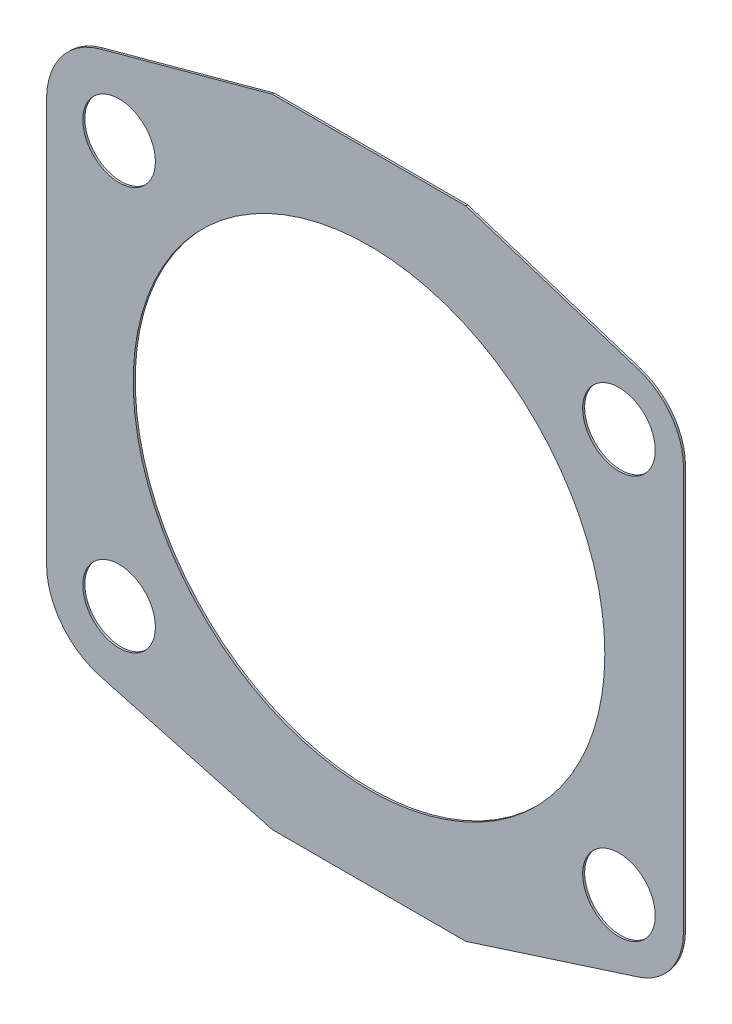
ISO-10303-21;
HEADER;
FILE_DESCRIPTION(('STEP AP214'),'2;1');
FILE_NAME('part.step','',(''),(''),'','','');
FILE_SCHEMA(('AUTOMOTIVE_DESIGN { 1 0 10303 214 1 1 1 1 }'));
ENDSEC;
DATA;
#1=APPLICATION_CONTEXT('core data for automotive mechanical design processes');
#2=APPLICATION_PROTOCOL_DEFINITION('international standard','automotive_design',2000,#1);
#3=PRODUCT_CONTEXT('',#1,'mechanical');
#4=PRODUCT('Part','Part','',(#3));
#5=PRODUCT_RELATED_PRODUCT_CATEGORY('part','',(#4));
#6=PRODUCT_DEFINITION_FORMATION('','',#4);
#7=PRODUCT_DEFINITION_CONTEXT('part definition',#1,'design');
#8=PRODUCT_DEFINITION('design','',#6,#7);
#9=PRODUCT_DEFINITION_SHAPE('','',#8);
#10=(LENGTH_UNIT() NAMED_UNIT(*) SI_UNIT(.MILLI.,.METRE.));
#11=(NAMED_UNIT(*) PLANE_ANGLE_UNIT() SI_UNIT($,.RADIAN.));
#12=(NAMED_UNIT(*) SI_UNIT($,.STERADIAN.) SOLID_ANGLE_UNIT());
#13=UNCERTAINTY_MEASURE_WITH_UNIT(LENGTH_MEASURE(1.E-05),#10,'distance_accuracy_value','');
#14=(GEOMETRIC_REPRESENTATION_CONTEXT(3) GLOBAL_UNCERTAINTY_ASSIGNED_CONTEXT((#13)) GLOBAL_UNIT_ASSIGNED_CONTEXT((#10,
#11,#12)) REPRESENTATION_CONTEXT('',''));
#15=CARTESIAN_POINT('',(0.,0.,0.));
#16=DIRECTION('',(0.,0.,1.));
#17=DIRECTION('',(1.,0.,0.));
#18=AXIS2_PLACEMENT_3D('',#15,#16,#17);
#19=CARTESIAN_POINT('',(-62.,-50.,0.5));
#20=DIRECTION('',(0.,0.,1.));
#21=DIRECTION('',(1.,0.,0.));
#22=AXIS2_PLACEMENT_3D('',#19,#20,#21);
#23=PLANE('',#22);
#24=CARTESIAN_POINT('',(62.,50.,0.5));
#25=DIRECTION('',(0.,0.,1.));
#26=DIRECTION('',(1.,0.,0.));
#27=AXIS2_PLACEMENT_3D('',#24,#25,#26);
#28=CIRCLE('',#27,9.);
#29=CARTESIAN_POINT('',(71.,50.,0.5));
#30=VERTEX_POINT('',#29);
#31=EDGE_CURVE('E303',#30,#30,#28,.T.);
#32=ORIENTED_EDGE('',*,*,#31,.F.);
#33=EDGE_LOOP('',(#32));
#34=FACE_BOUND('',#33,.T.);
#35=CARTESIAN_POINT('',(62.,-50.,0.5));
#36=DIRECTION('',(0.,0.,1.));
#37=DIRECTION('',(1.,0.,0.));
#38=AXIS2_PLACEMENT_3D('',#35,#36,#37);
#39=CIRCLE('',#38,9.);
#40=CARTESIAN_POINT('',(71.,-50.,0.5));
#41=VERTEX_POINT('',#40);
#42=EDGE_CURVE('E315',#41,#41,#39,.T.);
#43=ORIENTED_EDGE('',*,*,#42,.F.);
#44=EDGE_LOOP('',(#43));
#45=FACE_BOUND('',#44,.T.);
#46=CARTESIAN_POINT('',(-62.,-50.,0.5));
#47=DIRECTION('',(0.,0.,1.));
#48=DIRECTION('',(1.,0.,0.));
#49=AXIS2_PLACEMENT_3D('',#46,#47,#48);
#50=CIRCLE('',#49,18.);
#51=CARTESIAN_POINT('',(-80.,-50.,0.5));
#52=VERTEX_POINT('',#51);
#53=CARTESIAN_POINT('',(-66.7281486992586,-67.3679189852354,0.5));
#54=VERTEX_POINT('',#53);
#55=EDGE_CURVE('E185',#52,#54,#50,.T.);
#56=ORIENTED_EDGE('',*,*,#55,.T.);
#57=DIRECTION('',(0.964884388068632,-0.262674927736588,0.));
#58=VECTOR('',#57,1.);
#59=CARTESIAN_POINT('',(-66.7281486992586,-67.3679189852354,0.5));
#60=LINE('',#59,#58);
#61=CARTESIAN_POINT('',(-24.,-79.,0.5));
#62=VERTEX_POINT('',#61);
#63=EDGE_CURVE('E113',#54,#62,#60,.T.);
#64=ORIENTED_EDGE('',*,*,#63,.T.);
#65=DIRECTION('',(1.,0.,0.));
#66=VECTOR('',#65,1.);
#67=CARTESIAN_POINT('',(-24.,-79.,0.5));
#68=LINE('',#67,#66);
#69=CARTESIAN_POINT('',(24.,-79.,0.5));
#70=VERTEX_POINT('',#69);
#71=EDGE_CURVE('E212',#62,#70,#68,.T.);
#72=ORIENTED_EDGE('',*,*,#71,.T.);
#73=DIRECTION('',(0.952161074701265,0.30559660964044,0.));
#74=VECTOR('',#73,1.);
#75=CARTESIAN_POINT('',(24.,-79.,0.5));
#76=LINE('',#75,#74);
#77=CARTESIAN_POINT('',(66.889545754247,-65.2345771952202,0.5));
#78=VERTEX_POINT('',#77);
#79=EDGE_CURVE('E231',#70,#78,#76,.T.);
#80=ORIENTED_EDGE('',*,*,#79,.T.);
#81=CARTESIAN_POINT('',(62.,-50.,0.5));
#82=DIRECTION('',(0.,0.,1.));
#83=DIRECTION('',(1.,0.,0.));
#84=AXIS2_PLACEMENT_3D('',#81,#82,#83);
#85=CIRCLE('',#84,16.);
#86=CARTESIAN_POINT('',(78.,-50.,0.5));
#87=VERTEX_POINT('',#86);
#88=EDGE_CURVE('E228',#78,#87,#85,.T.);
#89=ORIENTED_EDGE('',*,*,#88,.T.);
#90=DIRECTION('',(0.,1.,0.));
#91=VECTOR('',#90,1.);
#92=CARTESIAN_POINT('',(78.,-50.,0.5));
#93=LINE('',#92,#91);
#94=CARTESIAN_POINT('',(78.,50.,0.5));
#95=VERTEX_POINT('',#94);
#96=EDGE_CURVE('E230',#87,#95,#93,.T.);
#97=ORIENTED_EDGE('',*,*,#96,.T.);
#98=CARTESIAN_POINT('',(62.,50.,0.5));
#99=DIRECTION('',(0.,0.,1.));
#100=DIRECTION('',(1.,0.,0.));
#101=AXIS2_PLACEMENT_3D('',#98,#99,#100);
#102=CIRCLE('',#101,16.);
#103=CARTESIAN_POINT('',(66.889545754247,65.2345771952202,0.5));
#104=VERTEX_POINT('',#103);
#105=EDGE_CURVE('E233',#95,#104,#102,.T.);
#106=ORIENTED_EDGE('',*,*,#105,.T.);
#107=DIRECTION('',(-0.952161074701265,0.30559660964044,0.));
#108=VECTOR('',#107,1.);
#109=CARTESIAN_POINT('',(66.889545754247,65.2345771952202,0.5));
#110=LINE('',#109,#108);
#111=CARTESIAN_POINT('',(24.,79.,0.5));
#112=VERTEX_POINT('',#111);
#113=EDGE_CURVE('E239',#104,#112,#110,.T.);
#114=ORIENTED_EDGE('',*,*,#113,.T.);
#115=DIRECTION('',(-1.,0.,0.));
#116=VECTOR('',#115,1.);
#117=CARTESIAN_POINT('',(24.,79.,0.5));
#118=LINE('',#117,#116);
#119=CARTESIAN_POINT('',(-24.,79.,0.5));
#120=VERTEX_POINT('',#119);
#121=EDGE_CURVE('E144',#112,#120,#118,.T.);
#122=ORIENTED_EDGE('',*,*,#121,.T.);
#123=DIRECTION('',(-0.964884388068632,-0.262674927736588,0.));
#124=VECTOR('',#123,1.);
#125=CARTESIAN_POINT('',(-24.,79.,0.5));
#126=LINE('',#125,#124);
#127=CARTESIAN_POINT('',(-66.7281486992586,67.3679189852354,0.5));
#128=VERTEX_POINT('',#127);
#129=EDGE_CURVE('E138',#120,#128,#126,.T.);
#130=ORIENTED_EDGE('',*,*,#129,.T.);
#131=CARTESIAN_POINT('',(-62.,50.,0.5));
#132=DIRECTION('',(0.,0.,1.));
#133=DIRECTION('',(1.,0.,0.));
#134=AXIS2_PLACEMENT_3D('',#131,#132,#133);
#135=CIRCLE('',#134,18.);
#136=CARTESIAN_POINT('',(-80.,50.,0.5));
#137=VERTEX_POINT('',#136);
#138=EDGE_CURVE('E142',#128,#137,#135,.T.);
#139=ORIENTED_EDGE('',*,*,#138,.T.);
#140=DIRECTION('',(0.,-1.,0.));
#141=VECTOR('',#140,1.);
#142=CARTESIAN_POINT('',(-80.,50.,0.5));
#143=LINE('',#142,#141);
#144=EDGE_CURVE('E58',#137,#52,#143,.T.);
#145=ORIENTED_EDGE('',*,*,#144,.T.);
#146=EDGE_LOOP('',(#56,#64,#72,#80,#89,#97,#106,#114,#122,#130,#139,#145));
#147=FACE_BOUND('',#146,.T.);
#148=CARTESIAN_POINT('',(0.,0.,0.5));
#149=DIRECTION('',(0.,0.,1.));
#150=DIRECTION('',(1.,0.,0.));
#151=AXIS2_PLACEMENT_3D('',#148,#149,#150);
#152=CIRCLE('',#151,58.5);
#153=CARTESIAN_POINT('',(58.5,0.,0.5));
#154=VERTEX_POINT('',#153);
#155=EDGE_CURVE('E166',#154,#154,#152,.T.);
#156=ORIENTED_EDGE('',*,*,#155,.F.);
#157=EDGE_LOOP('',(#156));
#158=FACE_BOUND('',#157,.T.);
#159=CARTESIAN_POINT('',(-62.,-50.,0.5));
#160=DIRECTION('',(0.,0.,1.));
#161=DIRECTION('',(1.,0.,0.));
#162=AXIS2_PLACEMENT_3D('',#159,#160,#161);
#163=CIRCLE('',#162,9.);
#164=CARTESIAN_POINT('',(-53.,-50.,0.5));
#165=VERTEX_POINT('',#164);
#166=EDGE_CURVE('E309',#165,#165,#163,.T.);
#167=ORIENTED_EDGE('',*,*,#166,.F.);
#168=EDGE_LOOP('',(#167));
#169=FACE_BOUND('',#168,.T.);
#170=CARTESIAN_POINT('',(-62.,50.,0.5));
#171=DIRECTION('',(0.,0.,1.));
#172=DIRECTION('',(1.,0.,0.));
#173=AXIS2_PLACEMENT_3D('',#170,#171,#172);
#174=CIRCLE('',#173,9.);
#175=CARTESIAN_POINT('',(-53.,50.,0.5));
#176=VERTEX_POINT('',#175);
#177=EDGE_CURVE('E294',#176,#176,#174,.T.);
#178=ORIENTED_EDGE('',*,*,#177,.F.);
#179=EDGE_LOOP('',(#178));
#180=FACE_BOUND('',#179,.T.);
#181=ADVANCED_FACE('F41',(#34,#45,#147,#158,#169,#180),#23,.T.);
#182=CARTESIAN_POINT('',(-62.,-50.,0.));
#183=DIRECTION('',(0.,0.,1.));
#184=DIRECTION('',(1.,0.,0.));
#185=AXIS2_PLACEMENT_3D('',#182,#183,#184);
#186=PLANE('',#185);
#187=CARTESIAN_POINT('',(-62.,-50.,0.));
#188=DIRECTION('',(0.,0.,1.));
#189=DIRECTION('',(1.,0.,0.));
#190=AXIS2_PLACEMENT_3D('',#187,#188,#189);
#191=CIRCLE('',#190,18.);
#192=CARTESIAN_POINT('',(-80.,-50.,0.));
#193=VERTEX_POINT('',#192);
#194=CARTESIAN_POINT('',(-66.7281486992586,-67.3679189852354,0.));
#195=VERTEX_POINT('',#194);
#196=EDGE_CURVE('E162',#193,#195,#191,.T.);
#197=ORIENTED_EDGE('',*,*,#196,.F.);
#198=DIRECTION('',(0.,-1.,0.));
#199=VECTOR('',#198,1.);
#200=CARTESIAN_POINT('',(-80.,50.,0.));
#201=LINE('',#200,#199);
#202=CARTESIAN_POINT('',(-80.,50.,0.));
#203=VERTEX_POINT('',#202);
#204=EDGE_CURVE('E105',#203,#193,#201,.T.);
#205=ORIENTED_EDGE('',*,*,#204,.F.);
#206=CARTESIAN_POINT('',(-62.,50.,0.));
#207=DIRECTION('',(0.,0.,1.));
#208=DIRECTION('',(1.,0.,0.));
#209=AXIS2_PLACEMENT_3D('',#206,#207,#208);
#210=CIRCLE('',#209,18.);
#211=CARTESIAN_POINT('',(-66.7281486992586,67.3679189852354,0.));
#212=VERTEX_POINT('',#211);
#213=EDGE_CURVE('E99',#212,#203,#210,.T.);
#214=ORIENTED_EDGE('',*,*,#213,.F.);
#215=DIRECTION('',(-0.964884388068632,-0.262674927736588,0.));
#216=VECTOR('',#215,1.);
#217=CARTESIAN_POINT('',(-24.,79.,0.));
#218=LINE('',#217,#216);
#219=CARTESIAN_POINT('',(-24.,79.,0.));
#220=VERTEX_POINT('',#219);
#221=EDGE_CURVE('E152',#220,#212,#218,.T.);
#222=ORIENTED_EDGE('',*,*,#221,.F.);
#223=DIRECTION('',(-1.,0.,0.));
#224=VECTOR('',#223,1.);
#225=CARTESIAN_POINT('',(24.,79.,0.));
#226=LINE('',#225,#224);
#227=CARTESIAN_POINT('',(24.,79.,0.));
#228=VERTEX_POINT('',#227);
#229=EDGE_CURVE('E180',#228,#220,#226,.T.);
#230=ORIENTED_EDGE('',*,*,#229,.F.);
#231=DIRECTION('',(-0.952161074701265,0.30559660964044,0.));
#232=VECTOR('',#231,1.);
#233=CARTESIAN_POINT('',(66.889545754247,65.2345771952202,0.));
#234=LINE('',#233,#232);
#235=CARTESIAN_POINT('',(66.889545754247,65.2345771952202,0.));
#236=VERTEX_POINT('',#235);
#237=EDGE_CURVE('E178',#236,#228,#234,.T.);
#238=ORIENTED_EDGE('',*,*,#237,.F.);
#239=CARTESIAN_POINT('',(62.,50.,0.));
#240=DIRECTION('',(0.,0.,1.));
#241=DIRECTION('',(1.,0.,0.));
#242=AXIS2_PLACEMENT_3D('',#239,#240,#241);
#243=CIRCLE('',#242,16.);
#244=CARTESIAN_POINT('',(78.,50.,0.));
#245=VERTEX_POINT('',#244);
#246=EDGE_CURVE('E176',#245,#236,#243,.T.);
#247=ORIENTED_EDGE('',*,*,#246,.F.);
#248=DIRECTION('',(0.,1.,0.));
#249=VECTOR('',#248,1.);
#250=CARTESIAN_POINT('',(78.,-50.,0.));
#251=LINE('',#250,#249);
#252=CARTESIAN_POINT('',(78.,-50.,0.));
#253=VERTEX_POINT('',#252);
#254=EDGE_CURVE('E174',#253,#245,#251,.T.);
#255=ORIENTED_EDGE('',*,*,#254,.F.);
#256=CARTESIAN_POINT('',(62.,-50.,0.));
#257=DIRECTION('',(0.,0.,1.));
#258=DIRECTION('',(1.,0.,0.));
#259=AXIS2_PLACEMENT_3D('',#256,#257,#258);
#260=CIRCLE('',#259,16.);
#261=CARTESIAN_POINT('',(66.889545754247,-65.2345771952202,0.));
#262=VERTEX_POINT('',#261);
#263=EDGE_CURVE('E172',#262,#253,#260,.T.);
#264=ORIENTED_EDGE('',*,*,#263,.F.);
#265=DIRECTION('',(0.952161074701265,0.30559660964044,0.));
#266=VECTOR('',#265,1.);
#267=CARTESIAN_POINT('',(24.,-79.,0.));
#268=LINE('',#267,#266);
#269=CARTESIAN_POINT('',(24.,-79.,0.));
#270=VERTEX_POINT('',#269);
#271=EDGE_CURVE('E170',#270,#262,#268,.T.);
#272=ORIENTED_EDGE('',*,*,#271,.F.);
#273=DIRECTION('',(1.,0.,0.));
#274=VECTOR('',#273,1.);
#275=CARTESIAN_POINT('',(-24.,-79.,0.));
#276=LINE('',#275,#274);
#277=CARTESIAN_POINT('',(-24.,-79.,0.));
#278=VERTEX_POINT('',#277);
#279=EDGE_CURVE('E168',#278,#270,#276,.T.);
#280=ORIENTED_EDGE('',*,*,#279,.F.);
#281=DIRECTION('',(0.964884388068632,-0.262674927736588,0.));
#282=VECTOR('',#281,1.);
#283=CARTESIAN_POINT('',(-66.7281486992586,-67.3679189852354,0.));
#284=LINE('',#283,#282);
#285=EDGE_CURVE('E165',#195,#278,#284,.T.);
#286=ORIENTED_EDGE('',*,*,#285,.F.);
#287=EDGE_LOOP('',(#197,#205,#214,#222,#230,#238,#247,#255,#264,#272,#280,#286));
#288=FACE_BOUND('',#287,.T.);
#289=CARTESIAN_POINT('',(0.,0.,0.));
#290=DIRECTION('',(0.,0.,1.));
#291=DIRECTION('',(1.,0.,0.));
#292=AXIS2_PLACEMENT_3D('',#289,#290,#291);
#293=CIRCLE('',#292,58.5);
#294=CARTESIAN_POINT('',(58.5,0.,0.));
#295=VERTEX_POINT('',#294);
#296=EDGE_CURVE('E318',#295,#295,#293,.T.);
#297=ORIENTED_EDGE('',*,*,#296,.T.);
#298=EDGE_LOOP('',(#297));
#299=FACE_BOUND('',#298,.T.);
#300=CARTESIAN_POINT('',(62.,-50.,0.));
#301=DIRECTION('',(0.,0.,1.));
#302=DIRECTION('',(1.,0.,0.));
#303=AXIS2_PLACEMENT_3D('',#300,#301,#302);
#304=CIRCLE('',#303,9.);
#305=CARTESIAN_POINT('',(71.,-50.,0.));
#306=VERTEX_POINT('',#305);
#307=EDGE_CURVE('E312',#306,#306,#304,.T.);
#308=ORIENTED_EDGE('',*,*,#307,.T.);
#309=EDGE_LOOP('',(#308));
#310=FACE_BOUND('',#309,.T.);
#311=CARTESIAN_POINT('',(-62.,-50.,0.));
#312=DIRECTION('',(0.,0.,1.));
#313=DIRECTION('',(1.,0.,0.));
#314=AXIS2_PLACEMENT_3D('',#311,#312,#313);
#315=CIRCLE('',#314,9.);
#316=CARTESIAN_POINT('',(-53.,-50.,0.));
#317=VERTEX_POINT('',#316);
#318=EDGE_CURVE('E306',#317,#317,#315,.T.);
#319=ORIENTED_EDGE('',*,*,#318,.T.);
#320=EDGE_LOOP('',(#319));
#321=FACE_BOUND('',#320,.T.);
#322=CARTESIAN_POINT('',(62.,50.,0.));
#323=DIRECTION('',(0.,0.,1.));
#324=DIRECTION('',(1.,0.,0.));
#325=AXIS2_PLACEMENT_3D('',#322,#323,#324);
#326=CIRCLE('',#325,9.);
#327=CARTESIAN_POINT('',(71.,50.,0.));
#328=VERTEX_POINT('',#327);
#329=EDGE_CURVE('E300',#328,#328,#326,.T.);
#330=ORIENTED_EDGE('',*,*,#329,.T.);
#331=EDGE_LOOP('',(#330));
#332=FACE_BOUND('',#331,.T.);
#333=CARTESIAN_POINT('',(-62.,50.,0.));
#334=DIRECTION('',(0.,0.,1.));
#335=DIRECTION('',(1.,0.,0.));
#336=AXIS2_PLACEMENT_3D('',#333,#334,#335);
#337=CIRCLE('',#336,9.);
#338=CARTESIAN_POINT('',(-53.,50.,0.));
#339=VERTEX_POINT('',#338);
#340=EDGE_CURVE('E297',#339,#339,#337,.T.);
#341=ORIENTED_EDGE('',*,*,#340,.T.);
#342=EDGE_LOOP('',(#341));
#343=FACE_BOUND('',#342,.T.);
#344=ADVANCED_FACE('F216',(#288,#299,#310,#321,#332,#343),#186,.F.);
#345=CARTESIAN_POINT('',(-62.,-50.,0.5));
#346=DIRECTION('',(0.,0.,-1.));
#347=DIRECTION('',(-1.,0.,0.));
#348=AXIS2_PLACEMENT_3D('',#345,#346,#347);
#349=CYLINDRICAL_SURFACE('',#348,18.);
#350=ORIENTED_EDGE('',*,*,#196,.T.);
#351=DIRECTION('',(0.,0.,-1.));
#352=VECTOR('',#351,1.);
#353=CARTESIAN_POINT('',(-66.7281486992586,-67.3679189852354,0.5));
#354=LINE('',#353,#352);
#355=EDGE_CURVE('E11',#54,#195,#354,.T.);
#356=ORIENTED_EDGE('',*,*,#355,.F.);
#357=ORIENTED_EDGE('',*,*,#55,.F.);
#358=DIRECTION('',(0.,0.,-1.));
#359=VECTOR('',#358,1.);
#360=CARTESIAN_POINT('',(-80.,-50.,0.5));
#361=LINE('',#360,#359);
#362=EDGE_CURVE('E158',#52,#193,#361,.T.);
#363=ORIENTED_EDGE('',*,*,#362,.T.);
#364=EDGE_LOOP('',(#350,#356,#357,#363));
#365=FACE_BOUND('',#364,.T.);
#366=ADVANCED_FACE('F43',(#365),#349,.T.);
#367=CARTESIAN_POINT('',(-66.7281486992586,-67.3679189852354,0.5));
#368=DIRECTION('',(0.262674927736588,0.964884388068632,0.));
#369=DIRECTION('',(-0.964884388068632,0.262674927736588,0.));
#370=AXIS2_PLACEMENT_3D('',#367,#368,#369);
#371=PLANE('',#370);
#372=ORIENTED_EDGE('',*,*,#285,.T.);
#373=DIRECTION('',(0.,0.,-1.));
#374=VECTOR('',#373,1.);
#375=CARTESIAN_POINT('',(-24.,-79.,0.5));
#376=LINE('',#375,#374);
#377=EDGE_CURVE('E50',#62,#278,#376,.T.);
#378=ORIENTED_EDGE('',*,*,#377,.F.);
#379=ORIENTED_EDGE('',*,*,#63,.F.);
#380=ORIENTED_EDGE('',*,*,#355,.T.);
#381=EDGE_LOOP('',(#372,#378,#379,#380));
#382=FACE_BOUND('',#381,.T.);
#383=ADVANCED_FACE('F442',(#382),#371,.F.);
#384=CARTESIAN_POINT('',(-24.,-79.,0.5));
#385=DIRECTION('',(0.,1.,0.));
#386=DIRECTION('',(0.,0.,1.));
#387=AXIS2_PLACEMENT_3D('',#384,#385,#386);
#388=PLANE('',#387);
#389=ORIENTED_EDGE('',*,*,#279,.T.);
#390=DIRECTION('',(0.,0.,-1.));
#391=VECTOR('',#390,1.);
#392=CARTESIAN_POINT('',(24.,-79.,0.5));
#393=LINE('',#392,#391);
#394=EDGE_CURVE('E204',#70,#270,#393,.T.);
#395=ORIENTED_EDGE('',*,*,#394,.F.);
#396=ORIENTED_EDGE('',*,*,#71,.F.);
#397=ORIENTED_EDGE('',*,*,#377,.T.);
#398=EDGE_LOOP('',(#389,#395,#396,#397));
#399=FACE_BOUND('',#398,.T.);
#400=ADVANCED_FACE('F210',(#399),#388,.F.);
#401=CARTESIAN_POINT('',(24.,-79.,0.5));
#402=DIRECTION('',(-0.30559660964044,0.952161074701265,0.));
#403=DIRECTION('',(-0.952161074701266,-0.30559660964044,0.));
#404=AXIS2_PLACEMENT_3D('',#401,#402,#403);
#405=PLANE('',#404);
#406=ORIENTED_EDGE('',*,*,#271,.T.);
#407=DIRECTION('',(0.,0.,-1.));
#408=VECTOR('',#407,1.);
#409=CARTESIAN_POINT('',(66.889545754247,-65.2345771952202,0.5));
#410=LINE('',#409,#408);
#411=EDGE_CURVE('E201',#78,#262,#410,.T.);
#412=ORIENTED_EDGE('',*,*,#411,.F.);
#413=ORIENTED_EDGE('',*,*,#79,.F.);
#414=ORIENTED_EDGE('',*,*,#394,.T.);
#415=EDGE_LOOP('',(#406,#412,#413,#414));
#416=FACE_BOUND('',#415,.T.);
#417=ADVANCED_FACE('F222',(#416),#405,.F.);
#418=CARTESIAN_POINT('',(62.,-50.,0.5));
#419=DIRECTION('',(0.,0.,-1.));
#420=DIRECTION('',(-1.,0.,0.));
#421=AXIS2_PLACEMENT_3D('',#418,#419,#420);
#422=CYLINDRICAL_SURFACE('',#421,16.);
#423=ORIENTED_EDGE('',*,*,#263,.T.);
#424=DIRECTION('',(0.,0.,-1.));
#425=VECTOR('',#424,1.);
#426=CARTESIAN_POINT('',(78.,-50.,0.5));
#427=LINE('',#426,#425);
#428=EDGE_CURVE('E198',#87,#253,#427,.T.);
#429=ORIENTED_EDGE('',*,*,#428,.F.);
#430=ORIENTED_EDGE('',*,*,#88,.F.);
#431=ORIENTED_EDGE('',*,*,#411,.T.);
#432=EDGE_LOOP('',(#423,#429,#430,#431));
#433=FACE_BOUND('',#432,.T.);
#434=ADVANCED_FACE('F226',(#433),#422,.T.);
#435=CARTESIAN_POINT('',(78.,-50.,0.5));
#436=DIRECTION('',(-1.,0.,0.));
#437=DIRECTION('',(0.,0.,1.));
#438=AXIS2_PLACEMENT_3D('',#435,#436,#437);
#439=PLANE('',#438);
#440=ORIENTED_EDGE('',*,*,#254,.T.);
#441=DIRECTION('',(0.,0.,-1.));
#442=VECTOR('',#441,1.);
#443=CARTESIAN_POINT('',(78.,50.,0.5));
#444=LINE('',#443,#442);
#445=EDGE_CURVE('E195',#95,#245,#444,.T.);
#446=ORIENTED_EDGE('',*,*,#445,.F.);
#447=ORIENTED_EDGE('',*,*,#96,.F.);
#448=ORIENTED_EDGE('',*,*,#428,.T.);
#449=EDGE_LOOP('',(#440,#446,#447,#448));
#450=FACE_BOUND('',#449,.T.);
#451=ADVANCED_FACE('F407',(#450),#439,.F.);
#452=CARTESIAN_POINT('',(62.,50.,0.5));
#453=DIRECTION('',(0.,0.,-1.));
#454=DIRECTION('',(-1.,0.,0.));
#455=AXIS2_PLACEMENT_3D('',#452,#453,#454);
#456=CYLINDRICAL_SURFACE('',#455,16.);
#457=ORIENTED_EDGE('',*,*,#246,.T.);
#458=DIRECTION('',(0.,0.,-1.));
#459=VECTOR('',#458,1.);
#460=CARTESIAN_POINT('',(66.889545754247,65.2345771952202,0.5));
#461=LINE('',#460,#459);
#462=EDGE_CURVE('E192',#104,#236,#461,.T.);
#463=ORIENTED_EDGE('',*,*,#462,.F.);
#464=ORIENTED_EDGE('',*,*,#105,.F.);
#465=ORIENTED_EDGE('',*,*,#445,.T.);
#466=EDGE_LOOP('',(#457,#463,#464,#465));
#467=FACE_BOUND('',#466,.T.);
#468=ADVANCED_FACE('F398',(#467),#456,.T.);
#469=CARTESIAN_POINT('',(66.889545754247,65.2345771952202,0.5));
#470=DIRECTION('',(-0.30559660964044,-0.952161074701265,0.));
#471=DIRECTION('',(0.952161074701266,-0.30559660964044,0.));
#472=AXIS2_PLACEMENT_3D('',#469,#470,#471);
#473=PLANE('',#472);
#474=ORIENTED_EDGE('',*,*,#237,.T.);
#475=DIRECTION('',(0.,0.,-1.));
#476=VECTOR('',#475,1.);
#477=CARTESIAN_POINT('',(24.,79.,0.5));
#478=LINE('',#477,#476);
#479=EDGE_CURVE('E189',#112,#228,#478,.T.);
#480=ORIENTED_EDGE('',*,*,#479,.F.);
#481=ORIENTED_EDGE('',*,*,#113,.F.);
#482=ORIENTED_EDGE('',*,*,#462,.T.);
#483=EDGE_LOOP('',(#474,#480,#481,#482));
#484=FACE_BOUND('',#483,.T.);
#485=ADVANCED_FACE('F245',(#484),#473,.F.);
#486=CARTESIAN_POINT('',(24.,79.,0.5));
#487=DIRECTION('',(0.,-1.,0.));
#488=DIRECTION('',(0.,0.,-1.));
#489=AXIS2_PLACEMENT_3D('',#486,#487,#488);
#490=PLANE('',#489);
#491=ORIENTED_EDGE('',*,*,#229,.T.);
#492=DIRECTION('',(0.,0.,-1.));
#493=VECTOR('',#492,1.);
#494=CARTESIAN_POINT('',(-24.,79.,0.5));
#495=LINE('',#494,#493);
#496=EDGE_CURVE('E153',#120,#220,#495,.T.);
#497=ORIENTED_EDGE('',*,*,#496,.F.);
#498=ORIENTED_EDGE('',*,*,#121,.F.);
#499=ORIENTED_EDGE('',*,*,#479,.T.);
#500=EDGE_LOOP('',(#491,#497,#498,#499));
#501=FACE_BOUND('',#500,.T.);
#502=ADVANCED_FACE('F249',(#501),#490,.F.);
#503=CARTESIAN_POINT('',(-24.,79.,0.5));
#504=DIRECTION('',(0.262674927736588,-0.964884388068632,0.));
#505=DIRECTION('',(0.964884388068632,0.262674927736588,0.));
#506=AXIS2_PLACEMENT_3D('',#503,#504,#505);
#507=PLANE('',#506);
#508=ORIENTED_EDGE('',*,*,#221,.T.);
#509=DIRECTION('',(0.,0.,-1.));
#510=VECTOR('',#509,1.);
#511=CARTESIAN_POINT('',(-66.7281486992586,67.3679189852354,0.5));
#512=LINE('',#511,#510);
#513=EDGE_CURVE('E149',#128,#212,#512,.T.);
#514=ORIENTED_EDGE('',*,*,#513,.F.);
#515=ORIENTED_EDGE('',*,*,#129,.F.);
#516=ORIENTED_EDGE('',*,*,#496,.T.);
#517=EDGE_LOOP('',(#508,#514,#515,#516));
#518=FACE_BOUND('',#517,.T.);
#519=ADVANCED_FACE('F150',(#518),#507,.F.);
#520=CARTESIAN_POINT('',(-62.,50.,0.5));
#521=DIRECTION('',(0.,0.,-1.));
#522=DIRECTION('',(-1.,0.,0.));
#523=AXIS2_PLACEMENT_3D('',#520,#521,#522);
#524=CYLINDRICAL_SURFACE('',#523,18.);
#525=ORIENTED_EDGE('',*,*,#213,.T.);
#526=DIRECTION('',(0.,0.,-1.));
#527=VECTOR('',#526,1.);
#528=CARTESIAN_POINT('',(-80.,50.,0.5));
#529=LINE('',#528,#527);
#530=EDGE_CURVE('E154',#137,#203,#529,.T.);
#531=ORIENTED_EDGE('',*,*,#530,.F.);
#532=ORIENTED_EDGE('',*,*,#138,.F.);
#533=ORIENTED_EDGE('',*,*,#513,.T.);
#534=EDGE_LOOP('',(#525,#531,#532,#533));
#535=FACE_BOUND('',#534,.T.);
#536=ADVANCED_FACE('F156',(#535),#524,.T.);
#537=CARTESIAN_POINT('',(-80.,50.,0.5));
#538=DIRECTION('',(1.,0.,0.));
#539=DIRECTION('',(0.,1.,0.));
#540=AXIS2_PLACEMENT_3D('',#537,#538,#539);
#541=PLANE('',#540);
#542=ORIENTED_EDGE('',*,*,#204,.T.);
#543=ORIENTED_EDGE('',*,*,#362,.F.);
#544=ORIENTED_EDGE('',*,*,#144,.F.);
#545=ORIENTED_EDGE('',*,*,#530,.T.);
#546=EDGE_LOOP('',(#542,#543,#544,#545));
#547=FACE_BOUND('',#546,.T.);
#548=ADVANCED_FACE('F253',(#547),#541,.F.);
#549=CARTESIAN_POINT('',(0.,0.,0.5));
#550=DIRECTION('',(0.,0.,-1.));
#551=DIRECTION('',(-1.,0.,0.));
#552=AXIS2_PLACEMENT_3D('',#549,#550,#551);
#553=CYLINDRICAL_SURFACE('',#552,58.5);
#554=ORIENTED_EDGE('',*,*,#155,.T.);
#555=EDGE_LOOP('',(#554));
#556=FACE_BOUND('',#555,.T.);
#557=ORIENTED_EDGE('',*,*,#296,.F.);
#558=EDGE_LOOP('',(#557));
#559=FACE_BOUND('',#558,.T.);
#560=ADVANCED_FACE('F255',(#556,#559),#553,.F.);
#561=CARTESIAN_POINT('',(62.,-50.,0.5));
#562=DIRECTION('',(0.,0.,-1.));
#563=DIRECTION('',(-1.,0.,0.));
#564=AXIS2_PLACEMENT_3D('',#561,#562,#563);
#565=CYLINDRICAL_SURFACE('',#564,9.);
#566=ORIENTED_EDGE('',*,*,#42,.T.);
#567=EDGE_LOOP('',(#566));
#568=FACE_BOUND('',#567,.T.);
#569=ORIENTED_EDGE('',*,*,#307,.F.);
#570=EDGE_LOOP('',(#569));
#571=FACE_BOUND('',#570,.T.);
#572=ADVANCED_FACE('F261',(#568,#571),#565,.F.);
#573=CARTESIAN_POINT('',(-62.,-50.,0.5));
#574=DIRECTION('',(0.,0.,-1.));
#575=DIRECTION('',(-1.,0.,0.));
#576=AXIS2_PLACEMENT_3D('',#573,#574,#575);
#577=CYLINDRICAL_SURFACE('',#576,9.);
#578=ORIENTED_EDGE('',*,*,#166,.T.);
#579=EDGE_LOOP('',(#578));
#580=FACE_BOUND('',#579,.T.);
#581=ORIENTED_EDGE('',*,*,#318,.F.);
#582=EDGE_LOOP('',(#581));
#583=FACE_BOUND('',#582,.T.);
#584=ADVANCED_FACE('F277',(#580,#583),#577,.F.);
#585=CARTESIAN_POINT('',(62.,50.,0.5));
#586=DIRECTION('',(0.,0.,-1.));
#587=DIRECTION('',(-1.,0.,0.));
#588=AXIS2_PLACEMENT_3D('',#585,#586,#587);
#589=CYLINDRICAL_SURFACE('',#588,9.);
#590=ORIENTED_EDGE('',*,*,#31,.T.);
#591=EDGE_LOOP('',(#590));
#592=FACE_BOUND('',#591,.T.);
#593=ORIENTED_EDGE('',*,*,#329,.F.);
#594=EDGE_LOOP('',(#593));
#595=FACE_BOUND('',#594,.T.);
#596=ADVANCED_FACE('F281',(#592,#595),#589,.F.);
#597=CARTESIAN_POINT('',(-62.,50.,0.5));
#598=DIRECTION('',(0.,0.,-1.));
#599=DIRECTION('',(-1.,0.,0.));
#600=AXIS2_PLACEMENT_3D('',#597,#598,#599);
#601=CYLINDRICAL_SURFACE('',#600,9.);
#602=ORIENTED_EDGE('',*,*,#177,.T.);
#603=EDGE_LOOP('',(#602));
#604=FACE_BOUND('',#603,.T.);
#605=ORIENTED_EDGE('',*,*,#340,.F.);
#606=EDGE_LOOP('',(#605));
#607=FACE_BOUND('',#606,.T.);
#608=ADVANCED_FACE('F285',(#604,#607),#601,.F.);
#609=CLOSED_SHELL('',(#181,#344,#366,#383,#400,#417,#434,#451,#468,#485,#502,#519,#536,#548,
#560,#572,#584,#596,#608));
#610=MANIFOLD_SOLID_BREP('B2',#609);
#611=ADVANCED_BREP_SHAPE_REPRESENTATION('',(#18,#610),#14);
#612=SHAPE_DEFINITION_REPRESENTATION(#9,#611);
ENDSEC;
END-ISO-10303-21;
